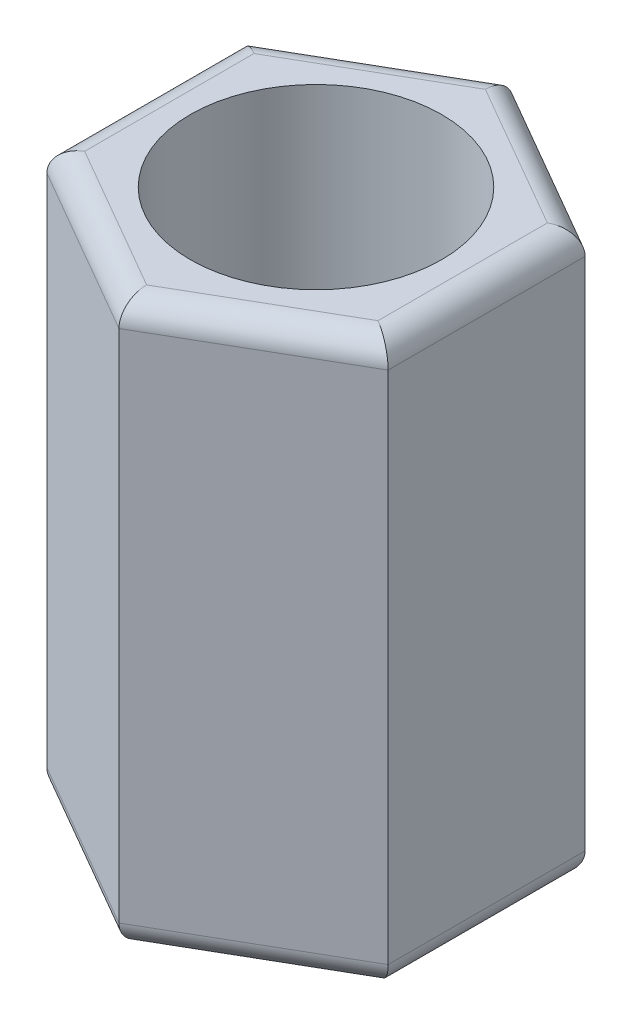
ISO-10303-21;
HEADER;
FILE_DESCRIPTION(('STEP AP214'),'2;1');
FILE_NAME('part.step','',(''),(''),'','','');
FILE_SCHEMA(('AUTOMOTIVE_DESIGN { 1 0 10303 214 1 1 1 1 }'));
ENDSEC;
DATA;
#1=APPLICATION_CONTEXT('core data for automotive mechanical design processes');
#2=APPLICATION_PROTOCOL_DEFINITION('international standard','automotive_design',2000,#1);
#3=PRODUCT_CONTEXT('',#1,'mechanical');
#4=PRODUCT('Part','Part','',(#3));
#5=PRODUCT_RELATED_PRODUCT_CATEGORY('part','',(#4));
#6=PRODUCT_DEFINITION_FORMATION('','',#4);
#7=PRODUCT_DEFINITION_CONTEXT('part definition',#1,'design');
#8=PRODUCT_DEFINITION('design','',#6,#7);
#9=PRODUCT_DEFINITION_SHAPE('','',#8);
#10=(LENGTH_UNIT() NAMED_UNIT(*) SI_UNIT(.MILLI.,.METRE.));
#11=(NAMED_UNIT(*) PLANE_ANGLE_UNIT() SI_UNIT($,.RADIAN.));
#12=(NAMED_UNIT(*) SI_UNIT($,.STERADIAN.) SOLID_ANGLE_UNIT());
#13=UNCERTAINTY_MEASURE_WITH_UNIT(LENGTH_MEASURE(1.E-05),#10,'distance_accuracy_value','');
#14=(GEOMETRIC_REPRESENTATION_CONTEXT(3) GLOBAL_UNCERTAINTY_ASSIGNED_CONTEXT((#13)) GLOBAL_UNIT_ASSIGNED_CONTEXT((#10,
#11,#12)) REPRESENTATION_CONTEXT('',''));
#15=CARTESIAN_POINT('',(0.,0.,0.));
#16=DIRECTION('',(0.,0.,1.));
#17=DIRECTION('',(1.,0.,0.));
#18=AXIS2_PLACEMENT_3D('',#15,#16,#17);
#19=CARTESIAN_POINT('',(0.,4.7,0.));
#20=DIRECTION('',(0.,1.,0.));
#21=DIRECTION('',(0.,0.,1.));
#22=AXIS2_PLACEMENT_3D('',#19,#20,#21);
#23=PLANE('',#22);
#24=DIRECTION('',(-0.866025403784438,0.,0.5));
#25=VECTOR('',#24,1.);
#26=CARTESIAN_POINT('',(-1.325,4.7,-0.649519052838329));
#27=LINE('',#26,#25);
#28=CARTESIAN_POINT('',(0.,4.7,-1.41450815951458));
#29=VERTEX_POINT('',#28);
#30=CARTESIAN_POINT('',(-1.225,4.7,-0.707254079757291));
#31=VERTEX_POINT('',#30);
#32=EDGE_CURVE('E55',#29,#31,#27,.T.);
#33=ORIENTED_EDGE('',*,*,#32,.T.);
#34=DIRECTION('',(0.,0.,1.));
#35=VECTOR('',#34,1.);
#36=CARTESIAN_POINT('',(-1.225,4.7,0.822724133595218));
#37=LINE('',#36,#35);
#38=CARTESIAN_POINT('',(-1.225,4.7,0.707254079757293));
#39=VERTEX_POINT('',#38);
#40=EDGE_CURVE('E11',#31,#39,#37,.T.);
#41=ORIENTED_EDGE('',*,*,#40,.T.);
#42=DIRECTION('',(0.866025403784439,0.,0.5));
#43=VECTOR('',#42,1.);
#44=CARTESIAN_POINT('',(0.1,4.7,1.47224318643355));
#45=LINE('',#44,#43);
#46=CARTESIAN_POINT('',(0.,4.7,1.41450815951458));
#47=VERTEX_POINT('',#46);
#48=EDGE_CURVE('E197',#39,#47,#45,.T.);
#49=ORIENTED_EDGE('',*,*,#48,.T.);
#50=DIRECTION('',(0.866025403784438,0.,-0.5));
#51=VECTOR('',#50,1.);
#52=CARTESIAN_POINT('',(1.325,4.7,0.649519052838329));
#53=LINE('',#52,#51);
#54=CARTESIAN_POINT('',(1.225,4.7,0.707254079757291));
#55=VERTEX_POINT('',#54);
#56=EDGE_CURVE('E193',#47,#55,#53,.T.);
#57=ORIENTED_EDGE('',*,*,#56,.T.);
#58=DIRECTION('',(0.,0.,-1.));
#59=VECTOR('',#58,1.);
#60=CARTESIAN_POINT('',(1.225,4.7,-0.822724133595217));
#61=LINE('',#60,#59);
#62=CARTESIAN_POINT('',(1.225,4.7,-0.707254079757292));
#63=VERTEX_POINT('',#62);
#64=EDGE_CURVE('E194',#55,#63,#61,.T.);
#65=ORIENTED_EDGE('',*,*,#64,.T.);
#66=DIRECTION('',(-0.866025403784439,0.,-0.5));
#67=VECTOR('',#66,1.);
#68=CARTESIAN_POINT('',(-0.1,4.7,-1.47224318643355));
#69=LINE('',#68,#67);
#70=EDGE_CURVE('E61',#63,#29,#69,.T.);
#71=ORIENTED_EDGE('',*,*,#70,.T.);
#72=EDGE_LOOP('',(#33,#41,#49,#57,#65,#71));
#73=FACE_BOUND('',#72,.T.);
#74=CARTESIAN_POINT('',(0.,4.7,0.));
#75=DIRECTION('',(0.,1.,0.));
#76=DIRECTION('',(0.,0.,1.));
#77=AXIS2_PLACEMENT_3D('',#74,#75,#76);
#78=CIRCLE('',#77,1.05);
#79=CARTESIAN_POINT('',(0.,4.7,1.05));
#80=VERTEX_POINT('',#79);
#81=EDGE_CURVE('E238',#80,#80,#78,.T.);
#82=ORIENTED_EDGE('',*,*,#81,.F.);
#83=EDGE_LOOP('',(#82));
#84=FACE_BOUND('',#83,.T.);
#85=ADVANCED_FACE('F43',(#73,#84),#23,.T.);
#86=CARTESIAN_POINT('',(0.,0.,0.));
#87=DIRECTION('',(0.,1.,0.));
#88=DIRECTION('',(0.,0.,1.));
#89=AXIS2_PLACEMENT_3D('',#86,#87,#88);
#90=PLANE('',#89);
#91=DIRECTION('',(-0.866025403784438,0.,0.5));
#92=VECTOR('',#91,1.);
#93=CARTESIAN_POINT('',(-0.612500000000001,0.,-1.06088111963594));
#94=LINE('',#93,#92);
#95=CARTESIAN_POINT('',(-1.225,0.,-0.707254079757291));
#96=VERTEX_POINT('',#95);
#97=CARTESIAN_POINT('',(0.,0.,-1.41450815951458));
#98=VERTEX_POINT('',#97);
#99=EDGE_CURVE('E221',#96,#98,#94,.F.);
#100=ORIENTED_EDGE('',*,*,#99,.T.);
#101=DIRECTION('',(-0.866025403784439,0.,-0.5));
#102=VECTOR('',#101,1.);
#103=CARTESIAN_POINT('',(0.6125,0.,-1.06088111963594));
#104=LINE('',#103,#102);
#105=CARTESIAN_POINT('',(1.225,0.,-0.707254079757292));
#106=VERTEX_POINT('',#105);
#107=EDGE_CURVE('E214',#98,#106,#104,.F.);
#108=ORIENTED_EDGE('',*,*,#107,.T.);
#109=DIRECTION('',(0.,0.,-1.));
#110=VECTOR('',#109,1.);
#111=CARTESIAN_POINT('',(1.225,0.,0.));
#112=LINE('',#111,#110);
#113=CARTESIAN_POINT('',(1.225,0.,0.707254079757291));
#114=VERTEX_POINT('',#113);
#115=EDGE_CURVE('E217',#106,#114,#112,.F.);
#116=ORIENTED_EDGE('',*,*,#115,.T.);
#117=DIRECTION('',(0.866025403784438,0.,-0.5));
#118=VECTOR('',#117,1.);
#119=CARTESIAN_POINT('',(0.612500000000001,0.,1.06088111963594));
#120=LINE('',#119,#118);
#121=CARTESIAN_POINT('',(0.,0.,1.41450815951458));
#122=VERTEX_POINT('',#121);
#123=EDGE_CURVE('E219',#114,#122,#120,.F.);
#124=ORIENTED_EDGE('',*,*,#123,.T.);
#125=DIRECTION('',(0.866025403784439,0.,0.5));
#126=VECTOR('',#125,1.);
#127=CARTESIAN_POINT('',(-0.6125,0.,1.06088111963594));
#128=LINE('',#127,#126);
#129=CARTESIAN_POINT('',(-1.225,0.,0.707254079757293));
#130=VERTEX_POINT('',#129);
#131=EDGE_CURVE('E225',#122,#130,#128,.F.);
#132=ORIENTED_EDGE('',*,*,#131,.T.);
#133=DIRECTION('',(0.,0.,1.));
#134=VECTOR('',#133,1.);
#135=CARTESIAN_POINT('',(-1.225,0.,0.));
#136=LINE('',#135,#134);
#137=EDGE_CURVE('E228',#130,#96,#136,.F.);
#138=ORIENTED_EDGE('',*,*,#137,.T.);
#139=EDGE_LOOP('',(#100,#108,#116,#124,#132,#138));
#140=FACE_BOUND('',#139,.T.);
#141=CARTESIAN_POINT('',(0.,0.,0.));
#142=DIRECTION('',(0.,1.,0.));
#143=DIRECTION('',(0.,0.,1.));
#144=AXIS2_PLACEMENT_3D('',#141,#142,#143);
#145=CIRCLE('',#144,1.05);
#146=CARTESIAN_POINT('',(0.,0.,1.05));
#147=VERTEX_POINT('',#146);
#148=EDGE_CURVE('E180',#147,#147,#145,.T.);
#149=ORIENTED_EDGE('',*,*,#148,.T.);
#150=EDGE_LOOP('',(#149));
#151=FACE_BOUND('',#150,.T.);
#152=ADVANCED_FACE('F248',(#140,#151),#90,.F.);
#153=CARTESIAN_POINT('',(1.425,4.7,0.822724133595217));
#154=DIRECTION('',(-1.,0.,0.));
#155=DIRECTION('',(0.,0.,1.));
#156=AXIS2_PLACEMENT_3D('',#153,#154,#155);
#157=PLANE('',#156);
#158=DIRECTION('',(0.,-1.,0.));
#159=VECTOR('',#158,1.);
#160=CARTESIAN_POINT('',(1.425,4.7,0.822724133595217));
#161=LINE('',#160,#159);
#162=CARTESIAN_POINT('',(1.425,4.5,0.822724133595217));
#163=VERTEX_POINT('',#162);
#164=CARTESIAN_POINT('',(1.425,0.2,0.822724133595217));
#165=VERTEX_POINT('',#164);
#166=EDGE_CURVE('E240',#163,#165,#161,.T.);
#167=ORIENTED_EDGE('',*,*,#166,.T.);
#168=DIRECTION('',(0.,0.,-1.));
#169=VECTOR('',#168,1.);
#170=CARTESIAN_POINT('',(1.425,0.2,0.822724133595217));
#171=LINE('',#170,#169);
#172=CARTESIAN_POINT('',(1.425,0.2,-0.822724133595217));
#173=VERTEX_POINT('',#172);
#174=EDGE_CURVE('E211',#165,#173,#171,.T.);
#175=ORIENTED_EDGE('',*,*,#174,.T.);
#176=DIRECTION('',(0.,-1.,0.));
#177=VECTOR('',#176,1.);
#178=CARTESIAN_POINT('',(1.425,4.7,-0.822724133595217));
#179=LINE('',#178,#177);
#180=CARTESIAN_POINT('',(1.425,4.5,-0.822724133595217));
#181=VERTEX_POINT('',#180);
#182=EDGE_CURVE('E152',#181,#173,#179,.T.);
#183=ORIENTED_EDGE('',*,*,#182,.F.);
#184=DIRECTION('',(0.,0.,-1.));
#185=VECTOR('',#184,1.);
#186=CARTESIAN_POINT('',(1.425,4.5,0.822724133595217));
#187=LINE('',#186,#185);
#188=EDGE_CURVE('E213',#181,#163,#187,.F.);
#189=ORIENTED_EDGE('',*,*,#188,.T.);
#190=EDGE_LOOP('',(#167,#175,#183,#189));
#191=FACE_BOUND('',#190,.T.);
#192=ADVANCED_FACE('F258',(#191),#157,.F.);
#193=CARTESIAN_POINT('',(1.425,4.7,-0.822724133595217));
#194=DIRECTION('',(-0.5,0.,0.866025403784439));
#195=DIRECTION('',(0.866025403784439,0.,0.5));
#196=AXIS2_PLACEMENT_3D('',#193,#194,#195);
#197=PLANE('',#196);
#198=ORIENTED_EDGE('',*,*,#182,.T.);
#199=DIRECTION('',(-0.866025403784439,0.,-0.5));
#200=VECTOR('',#199,1.);
#201=CARTESIAN_POINT('',(1.425,0.2,-0.822724133595217));
#202=LINE('',#201,#200);
#203=CARTESIAN_POINT('',(0.,0.2,-1.64544826719043));
#204=VERTEX_POINT('',#203);
#205=EDGE_CURVE('E153',#173,#204,#202,.T.);
#206=ORIENTED_EDGE('',*,*,#205,.T.);
#207=DIRECTION('',(0.,-1.,0.));
#208=VECTOR('',#207,1.);
#209=CARTESIAN_POINT('',(0.,4.7,-1.64544826719043));
#210=LINE('',#209,#208);
#211=CARTESIAN_POINT('',(0.,4.5,-1.64544826719043));
#212=VERTEX_POINT('',#211);
#213=EDGE_CURVE('E137',#212,#204,#210,.T.);
#214=ORIENTED_EDGE('',*,*,#213,.F.);
#215=DIRECTION('',(-0.866025403784439,0.,-0.5));
#216=VECTOR('',#215,1.);
#217=CARTESIAN_POINT('',(1.425,4.5,-0.822724133595217));
#218=LINE('',#217,#216);
#219=EDGE_CURVE('E147',#212,#181,#218,.F.);
#220=ORIENTED_EDGE('',*,*,#219,.T.);
#221=EDGE_LOOP('',(#198,#206,#214,#220));
#222=FACE_BOUND('',#221,.T.);
#223=ADVANCED_FACE('F149',(#222),#197,.F.);
#224=CARTESIAN_POINT('',(0.,4.7,-1.64544826719043));
#225=DIRECTION('',(0.5,0.,0.866025403784438));
#226=DIRECTION('',(0.866025403784438,0.,-0.5));
#227=AXIS2_PLACEMENT_3D('',#224,#225,#226);
#228=PLANE('',#227);
#229=ORIENTED_EDGE('',*,*,#213,.T.);
#230=DIRECTION('',(-0.866025403784438,0.,0.5));
#231=VECTOR('',#230,1.);
#232=CARTESIAN_POINT('',(0.,0.2,-1.64544826719043));
#233=LINE('',#232,#231);
#234=CARTESIAN_POINT('',(-1.425,0.2,-0.822724133595217));
#235=VERTEX_POINT('',#234);
#236=EDGE_CURVE('E142',#204,#235,#233,.T.);
#237=ORIENTED_EDGE('',*,*,#236,.T.);
#238=DIRECTION('',(0.,-1.,0.));
#239=VECTOR('',#238,1.);
#240=CARTESIAN_POINT('',(-1.425,4.7,-0.822724133595217));
#241=LINE('',#240,#239);
#242=CARTESIAN_POINT('',(-1.425,4.5,-0.822724133595217));
#243=VERTEX_POINT('',#242);
#244=EDGE_CURVE('E139',#243,#235,#241,.T.);
#245=ORIENTED_EDGE('',*,*,#244,.F.);
#246=DIRECTION('',(-0.866025403784438,0.,0.5));
#247=VECTOR('',#246,1.);
#248=CARTESIAN_POINT('',(0.,4.5,-1.64544826719043));
#249=LINE('',#248,#247);
#250=EDGE_CURVE('E131',#243,#212,#249,.F.);
#251=ORIENTED_EDGE('',*,*,#250,.T.);
#252=EDGE_LOOP('',(#229,#237,#245,#251));
#253=FACE_BOUND('',#252,.T.);
#254=ADVANCED_FACE('F134',(#253),#228,.F.);
#255=CARTESIAN_POINT('',(-1.425,4.7,-0.822724133595217));
#256=DIRECTION('',(1.,0.,0.));
#257=DIRECTION('',(0.,0.,-1.));
#258=AXIS2_PLACEMENT_3D('',#255,#256,#257);
#259=PLANE('',#258);
#260=ORIENTED_EDGE('',*,*,#244,.T.);
#261=DIRECTION('',(0.,0.,1.));
#262=VECTOR('',#261,1.);
#263=CARTESIAN_POINT('',(-1.425,0.2,-0.822724133595217));
#264=LINE('',#263,#262);
#265=CARTESIAN_POINT('',(-1.425,0.2,0.822724133595218));
#266=VERTEX_POINT('',#265);
#267=EDGE_CURVE('E200',#235,#266,#264,.T.);
#268=ORIENTED_EDGE('',*,*,#267,.T.);
#269=DIRECTION('',(0.,-1.,0.));
#270=VECTOR('',#269,1.);
#271=CARTESIAN_POINT('',(-1.425,4.7,0.822724133595218));
#272=LINE('',#271,#270);
#273=CARTESIAN_POINT('',(-1.425,4.5,0.822724133595218));
#274=VERTEX_POINT('',#273);
#275=EDGE_CURVE('E232',#274,#266,#272,.T.);
#276=ORIENTED_EDGE('',*,*,#275,.F.);
#277=DIRECTION('',(0.,0.,1.));
#278=VECTOR('',#277,1.);
#279=CARTESIAN_POINT('',(-1.425,4.5,-0.822724133595217));
#280=LINE('',#279,#278);
#281=EDGE_CURVE('E203',#274,#243,#280,.F.);
#282=ORIENTED_EDGE('',*,*,#281,.T.);
#283=EDGE_LOOP('',(#260,#268,#276,#282));
#284=FACE_BOUND('',#283,.T.);
#285=ADVANCED_FACE('F268',(#284),#259,.F.);
#286=CARTESIAN_POINT('',(-1.425,4.7,0.822724133595218));
#287=DIRECTION('',(0.5,0.,-0.866025403784439));
#288=DIRECTION('',(-0.866025403784439,0.,-0.5));
#289=AXIS2_PLACEMENT_3D('',#286,#287,#288);
#290=PLANE('',#289);
#291=ORIENTED_EDGE('',*,*,#275,.T.);
#292=DIRECTION('',(0.866025403784439,0.,0.5));
#293=VECTOR('',#292,1.);
#294=CARTESIAN_POINT('',(-1.425,0.2,0.822724133595218));
#295=LINE('',#294,#293);
#296=CARTESIAN_POINT('',(0.,0.2,1.64544826719043));
#297=VERTEX_POINT('',#296);
#298=EDGE_CURVE('E141',#266,#297,#295,.T.);
#299=ORIENTED_EDGE('',*,*,#298,.T.);
#300=DIRECTION('',(0.,-1.,0.));
#301=VECTOR('',#300,1.);
#302=CARTESIAN_POINT('',(0.,4.7,1.64544826719043));
#303=LINE('',#302,#301);
#304=CARTESIAN_POINT('',(0.,4.5,1.64544826719043));
#305=VERTEX_POINT('',#304);
#306=EDGE_CURVE('E231',#305,#297,#303,.T.);
#307=ORIENTED_EDGE('',*,*,#306,.F.);
#308=DIRECTION('',(0.866025403784439,0.,0.5));
#309=VECTOR('',#308,1.);
#310=CARTESIAN_POINT('',(-1.425,4.5,0.822724133595218));
#311=LINE('',#310,#309);
#312=EDGE_CURVE('E202',#305,#274,#311,.F.);
#313=ORIENTED_EDGE('',*,*,#312,.T.);
#314=EDGE_LOOP('',(#291,#299,#307,#313));
#315=FACE_BOUND('',#314,.T.);
#316=ADVANCED_FACE('F262',(#315),#290,.F.);
#317=CARTESIAN_POINT('',(0.,4.7,1.64544826719043));
#318=DIRECTION('',(-0.5,0.,-0.866025403784438));
#319=DIRECTION('',(-0.866025403784438,0.,0.5));
#320=AXIS2_PLACEMENT_3D('',#317,#318,#319);
#321=PLANE('',#320);
#322=ORIENTED_EDGE('',*,*,#306,.T.);
#323=DIRECTION('',(0.866025403784438,0.,-0.5));
#324=VECTOR('',#323,1.);
#325=CARTESIAN_POINT('',(0.,0.2,1.64544826719043));
#326=LINE('',#325,#324);
#327=EDGE_CURVE('E210',#297,#165,#326,.T.);
#328=ORIENTED_EDGE('',*,*,#327,.T.);
#329=ORIENTED_EDGE('',*,*,#166,.F.);
#330=DIRECTION('',(0.866025403784438,0.,-0.5));
#331=VECTOR('',#330,1.);
#332=CARTESIAN_POINT('',(0.,4.5,1.64544826719043));
#333=LINE('',#332,#331);
#334=EDGE_CURVE('E207',#163,#305,#333,.F.);
#335=ORIENTED_EDGE('',*,*,#334,.T.);
#336=EDGE_LOOP('',(#322,#328,#329,#335));
#337=FACE_BOUND('',#336,.T.);
#338=ADVANCED_FACE('F261',(#337),#321,.F.);
#339=CARTESIAN_POINT('',(0.,4.7,0.));
#340=DIRECTION('',(0.,-1.,0.));
#341=DIRECTION('',(0.,0.,-1.));
#342=AXIS2_PLACEMENT_3D('',#339,#340,#341);
#343=CYLINDRICAL_SURFACE('',#342,1.05);
#344=ORIENTED_EDGE('',*,*,#81,.T.);
#345=EDGE_LOOP('',(#344));
#346=FACE_BOUND('',#345,.T.);
#347=ORIENTED_EDGE('',*,*,#148,.F.);
#348=EDGE_LOOP('',(#347));
#349=FACE_BOUND('',#348,.T.);
#350=ADVANCED_FACE('F247',(#346,#349),#343,.F.);
#351=CARTESIAN_POINT('',(-1.325,0.2,0.649519052838331));
#352=DIRECTION('',(0.866025403784439,0.,0.5));
#353=DIRECTION('',(0.5,0.,-0.866025403784439));
#354=AXIS2_PLACEMENT_3D('',#351,#352,#353);
#355=CYLINDRICAL_SURFACE('',#354,0.2);
#356=CARTESIAN_POINT('',(-1.225,0.2,0.707254079757293));
#357=DIRECTION('',(0.5,0.,0.866025403784439));
#358=DIRECTION('',(-0.866025403784439,0.,0.5));
#359=AXIS2_PLACEMENT_3D('',#356,#357,#358);
#360=ELLIPSE('',#359,0.23094010767585,0.2);
#361=EDGE_CURVE('E179',#130,#266,#360,.F.);
#362=ORIENTED_EDGE('',*,*,#361,.F.);
#363=ORIENTED_EDGE('',*,*,#131,.F.);
#364=CARTESIAN_POINT('',(0.,0.2,1.41450815951458));
#365=DIRECTION('',(1.,0.,0.));
#366=DIRECTION('',(0.,0.,1.));
#367=AXIS2_PLACEMENT_3D('',#364,#365,#366);
#368=ELLIPSE('',#367,0.23094010767585,0.2);
#369=EDGE_CURVE('E172',#297,#122,#368,.T.);
#370=ORIENTED_EDGE('',*,*,#369,.F.);
#371=ORIENTED_EDGE('',*,*,#298,.F.);
#372=EDGE_LOOP('',(#362,#363,#370,#371));
#373=FACE_BOUND('',#372,.T.);
#374=ADVANCED_FACE('F297',(#373),#355,.T.);
#375=CARTESIAN_POINT('',(-0.1,0.2,1.47224318643355));
#376=DIRECTION('',(0.866025403784438,0.,-0.5));
#377=DIRECTION('',(-0.5,0.,-0.866025403784438));
#378=AXIS2_PLACEMENT_3D('',#375,#376,#377);
#379=CYLINDRICAL_SURFACE('',#378,0.2);
#380=ORIENTED_EDGE('',*,*,#369,.T.);
#381=ORIENTED_EDGE('',*,*,#123,.F.);
#382=CARTESIAN_POINT('',(1.225,0.2,0.707254079757291));
#383=DIRECTION('',(0.5,0.,-0.866025403784439));
#384=DIRECTION('',(0.866025403784439,0.,0.5));
#385=AXIS2_PLACEMENT_3D('',#382,#383,#384);
#386=ELLIPSE('',#385,0.23094010767585,0.2);
#387=EDGE_CURVE('E182',#165,#114,#386,.T.);
#388=ORIENTED_EDGE('',*,*,#387,.F.);
#389=ORIENTED_EDGE('',*,*,#327,.F.);
#390=EDGE_LOOP('',(#380,#381,#388,#389));
#391=FACE_BOUND('',#390,.T.);
#392=ADVANCED_FACE('F293',(#391),#379,.T.);
#393=CARTESIAN_POINT('',(-1.225,0.2,-0.822724133595217));
#394=DIRECTION('',(0.,0.,1.));
#395=DIRECTION('',(1.,0.,0.));
#396=AXIS2_PLACEMENT_3D('',#393,#394,#395);
#397=CYLINDRICAL_SURFACE('',#396,0.2);
#398=ORIENTED_EDGE('',*,*,#361,.T.);
#399=ORIENTED_EDGE('',*,*,#267,.F.);
#400=CARTESIAN_POINT('',(-1.225,0.2,-0.707254079757291));
#401=DIRECTION('',(-0.5,0.,0.866025403784439));
#402=DIRECTION('',(0.866025403784439,0.,0.5));
#403=AXIS2_PLACEMENT_3D('',#400,#401,#402);
#404=ELLIPSE('',#403,0.23094010767585,0.2);
#405=EDGE_CURVE('E184',#96,#235,#404,.F.);
#406=ORIENTED_EDGE('',*,*,#405,.F.);
#407=ORIENTED_EDGE('',*,*,#137,.F.);
#408=EDGE_LOOP('',(#398,#399,#406,#407));
#409=FACE_BOUND('',#408,.T.);
#410=ADVANCED_FACE('F292',(#409),#397,.T.);
#411=CARTESIAN_POINT('',(1.225,0.2,0.822724133595217));
#412=DIRECTION('',(0.,0.,-1.));
#413=DIRECTION('',(-1.,0.,0.));
#414=AXIS2_PLACEMENT_3D('',#411,#412,#413);
#415=CYLINDRICAL_SURFACE('',#414,0.2);
#416=ORIENTED_EDGE('',*,*,#387,.T.);
#417=ORIENTED_EDGE('',*,*,#115,.F.);
#418=CARTESIAN_POINT('',(1.225,0.2,-0.707254079757292));
#419=DIRECTION('',(-0.5,0.,-0.866025403784438));
#420=DIRECTION('',(0.866025403784439,0.,-0.5));
#421=AXIS2_PLACEMENT_3D('',#418,#419,#420);
#422=ELLIPSE('',#421,0.23094010767585,0.2);
#423=EDGE_CURVE('E190',#173,#106,#422,.T.);
#424=ORIENTED_EDGE('',*,*,#423,.F.);
#425=ORIENTED_EDGE('',*,*,#174,.F.);
#426=EDGE_LOOP('',(#416,#417,#424,#425));
#427=FACE_BOUND('',#426,.T.);
#428=ADVANCED_FACE('F290',(#427),#415,.T.);
#429=CARTESIAN_POINT('',(0.1,0.2,-1.47224318643355));
#430=DIRECTION('',(-0.866025403784438,0.,0.5));
#431=DIRECTION('',(0.5,0.,0.866025403784438));
#432=AXIS2_PLACEMENT_3D('',#429,#430,#431);
#433=CYLINDRICAL_SURFACE('',#432,0.2);
#434=ORIENTED_EDGE('',*,*,#405,.T.);
#435=ORIENTED_EDGE('',*,*,#236,.F.);
#436=CARTESIAN_POINT('',(0.,0.2,-1.41450815951458));
#437=DIRECTION('',(-1.,0.,0.));
#438=DIRECTION('',(0.,0.,1.));
#439=AXIS2_PLACEMENT_3D('',#436,#437,#438);
#440=ELLIPSE('',#439,0.23094010767585,0.2);
#441=EDGE_CURVE('E187',#98,#204,#440,.F.);
#442=ORIENTED_EDGE('',*,*,#441,.F.);
#443=ORIENTED_EDGE('',*,*,#99,.F.);
#444=EDGE_LOOP('',(#434,#435,#442,#443));
#445=FACE_BOUND('',#444,.T.);
#446=ADVANCED_FACE('F281',(#445),#433,.T.);
#447=CARTESIAN_POINT('',(1.325,0.2,-0.64951905283833));
#448=DIRECTION('',(-0.866025403784439,0.,-0.5));
#449=DIRECTION('',(-0.5,0.,0.866025403784439));
#450=AXIS2_PLACEMENT_3D('',#447,#448,#449);
#451=CYLINDRICAL_SURFACE('',#450,0.2);
#452=ORIENTED_EDGE('',*,*,#423,.T.);
#453=ORIENTED_EDGE('',*,*,#107,.F.);
#454=ORIENTED_EDGE('',*,*,#441,.T.);
#455=ORIENTED_EDGE('',*,*,#205,.F.);
#456=EDGE_LOOP('',(#452,#453,#454,#455));
#457=FACE_BOUND('',#456,.T.);
#458=ADVANCED_FACE('F278',(#457),#451,.T.);
#459=CARTESIAN_POINT('',(1.225,4.5,0.));
#460=DIRECTION('',(0.,0.,1.));
#461=DIRECTION('',(1.,0.,0.));
#462=AXIS2_PLACEMENT_3D('',#459,#460,#461);
#463=CYLINDRICAL_SURFACE('',#462,0.2);
#464=CARTESIAN_POINT('',(1.225,4.5,0.707254079757292));
#465=DIRECTION('',(-0.5,0.,0.866025403784439));
#466=DIRECTION('',(-0.866025403784439,0.,-0.5));
#467=AXIS2_PLACEMENT_3D('',#464,#465,#466);
#468=ELLIPSE('',#467,0.23094010767585,0.2);
#469=EDGE_CURVE('E162',#163,#55,#468,.T.);
#470=ORIENTED_EDGE('',*,*,#469,.F.);
#471=ORIENTED_EDGE('',*,*,#188,.F.);
#472=CARTESIAN_POINT('',(1.225,4.5,-0.707254079757292));
#473=DIRECTION('',(0.5,0.,0.866025403784438));
#474=DIRECTION('',(-0.866025403784439,0.,0.5));
#475=AXIS2_PLACEMENT_3D('',#472,#473,#474);
#476=ELLIPSE('',#475,0.23094010767585,0.2);
#477=EDGE_CURVE('E50',#63,#181,#476,.F.);
#478=ORIENTED_EDGE('',*,*,#477,.F.);
#479=ORIENTED_EDGE('',*,*,#64,.F.);
#480=EDGE_LOOP('',(#470,#471,#478,#479));
#481=FACE_BOUND('',#480,.T.);
#482=ADVANCED_FACE('F44',(#481),#463,.T.);
#483=CARTESIAN_POINT('',(0.6125,4.5,-1.06088111963594));
#484=DIRECTION('',(0.866025403784439,0.,0.5));
#485=DIRECTION('',(0.5,0.,-0.866025403784439));
#486=AXIS2_PLACEMENT_3D('',#483,#484,#485);
#487=CYLINDRICAL_SURFACE('',#486,0.2);
#488=ORIENTED_EDGE('',*,*,#477,.T.);
#489=ORIENTED_EDGE('',*,*,#219,.F.);
#490=CARTESIAN_POINT('',(0.,4.5,-1.41450815951458));
#491=DIRECTION('',(1.,0.,0.));
#492=DIRECTION('',(0.,0.,1.));
#493=AXIS2_PLACEMENT_3D('',#490,#491,#492);
#494=ELLIPSE('',#493,0.23094010767585,0.2);
#495=EDGE_CURVE('E157',#29,#212,#494,.F.);
#496=ORIENTED_EDGE('',*,*,#495,.F.);
#497=ORIENTED_EDGE('',*,*,#70,.F.);
#498=EDGE_LOOP('',(#488,#489,#496,#497));
#499=FACE_BOUND('',#498,.T.);
#500=ADVANCED_FACE('F158',(#499),#487,.T.);
#501=CARTESIAN_POINT('',(0.612500000000001,4.5,1.06088111963594));
#502=DIRECTION('',(-0.866025403784438,0.,0.5));
#503=DIRECTION('',(0.5,0.,0.866025403784438));
#504=AXIS2_PLACEMENT_3D('',#501,#502,#503);
#505=CYLINDRICAL_SURFACE('',#504,0.2);
#506=ORIENTED_EDGE('',*,*,#469,.T.);
#507=ORIENTED_EDGE('',*,*,#56,.F.);
#508=CARTESIAN_POINT('',(0.,4.5,1.41450815951458));
#509=DIRECTION('',(-1.,0.,0.));
#510=DIRECTION('',(0.,0.,-1.));
#511=AXIS2_PLACEMENT_3D('',#508,#509,#510);
#512=ELLIPSE('',#511,0.23094010767585,0.2);
#513=EDGE_CURVE('E163',#305,#47,#512,.T.);
#514=ORIENTED_EDGE('',*,*,#513,.F.);
#515=ORIENTED_EDGE('',*,*,#334,.F.);
#516=EDGE_LOOP('',(#506,#507,#514,#515));
#517=FACE_BOUND('',#516,.T.);
#518=ADVANCED_FACE('F314',(#517),#505,.T.);
#519=CARTESIAN_POINT('',(-0.612500000000001,4.5,-1.06088111963594));
#520=DIRECTION('',(0.866025403784438,0.,-0.5));
#521=DIRECTION('',(-0.5,0.,-0.866025403784438));
#522=AXIS2_PLACEMENT_3D('',#519,#520,#521);
#523=CYLINDRICAL_SURFACE('',#522,0.2);
#524=ORIENTED_EDGE('',*,*,#495,.T.);
#525=ORIENTED_EDGE('',*,*,#250,.F.);
#526=CARTESIAN_POINT('',(-1.225,4.5,-0.707254079757292));
#527=DIRECTION('',(0.5,0.,-0.866025403784439));
#528=DIRECTION('',(0.866025403784439,0.,0.5));
#529=AXIS2_PLACEMENT_3D('',#526,#527,#528);
#530=ELLIPSE('',#529,0.23094010767585,0.2);
#531=EDGE_CURVE('E169',#31,#243,#530,.F.);
#532=ORIENTED_EDGE('',*,*,#531,.F.);
#533=ORIENTED_EDGE('',*,*,#32,.F.);
#534=EDGE_LOOP('',(#524,#525,#532,#533));
#535=FACE_BOUND('',#534,.T.);
#536=ADVANCED_FACE('F165',(#535),#523,.T.);
#537=CARTESIAN_POINT('',(-0.6125,4.5,1.06088111963594));
#538=DIRECTION('',(-0.866025403784439,0.,-0.5));
#539=DIRECTION('',(-0.5,0.,0.866025403784439));
#540=AXIS2_PLACEMENT_3D('',#537,#538,#539);
#541=CYLINDRICAL_SURFACE('',#540,0.2);
#542=ORIENTED_EDGE('',*,*,#513,.T.);
#543=ORIENTED_EDGE('',*,*,#48,.F.);
#544=CARTESIAN_POINT('',(-1.225,4.5,0.707254079757293));
#545=DIRECTION('',(-0.5,0.,-0.866025403784439));
#546=DIRECTION('',(-0.866025403784439,0.,0.5));
#547=AXIS2_PLACEMENT_3D('',#544,#545,#546);
#548=ELLIPSE('',#547,0.23094010767585,0.2);
#549=EDGE_CURVE('E175',#274,#39,#548,.T.);
#550=ORIENTED_EDGE('',*,*,#549,.F.);
#551=ORIENTED_EDGE('',*,*,#312,.F.);
#552=EDGE_LOOP('',(#542,#543,#550,#551));
#553=FACE_BOUND('',#552,.T.);
#554=ADVANCED_FACE('F307',(#553),#541,.T.);
#555=CARTESIAN_POINT('',(-1.225,4.5,0.));
#556=DIRECTION('',(0.,0.,-1.));
#557=DIRECTION('',(-1.,0.,0.));
#558=AXIS2_PLACEMENT_3D('',#555,#556,#557);
#559=CYLINDRICAL_SURFACE('',#558,0.2);
#560=ORIENTED_EDGE('',*,*,#531,.T.);
#561=ORIENTED_EDGE('',*,*,#281,.F.);
#562=ORIENTED_EDGE('',*,*,#549,.T.);
#563=ORIENTED_EDGE('',*,*,#40,.F.);
#564=EDGE_LOOP('',(#560,#561,#562,#563));
#565=FACE_BOUND('',#564,.T.);
#566=ADVANCED_FACE('F301',(#565),#559,.T.);
#567=CLOSED_SHELL('',(#85,#152,#192,#223,#254,#285,#316,#338,#350,#374,#392,#410,#428,#446,#458,
#482,#500,#518,#536,#554,#566));
#568=MANIFOLD_SOLID_BREP('B2',#567);
#569=ADVANCED_BREP_SHAPE_REPRESENTATION('',(#18,#568),#14);
#570=SHAPE_DEFINITION_REPRESENTATION(#9,#569);
ENDSEC;
END-ISO-10303-21;
